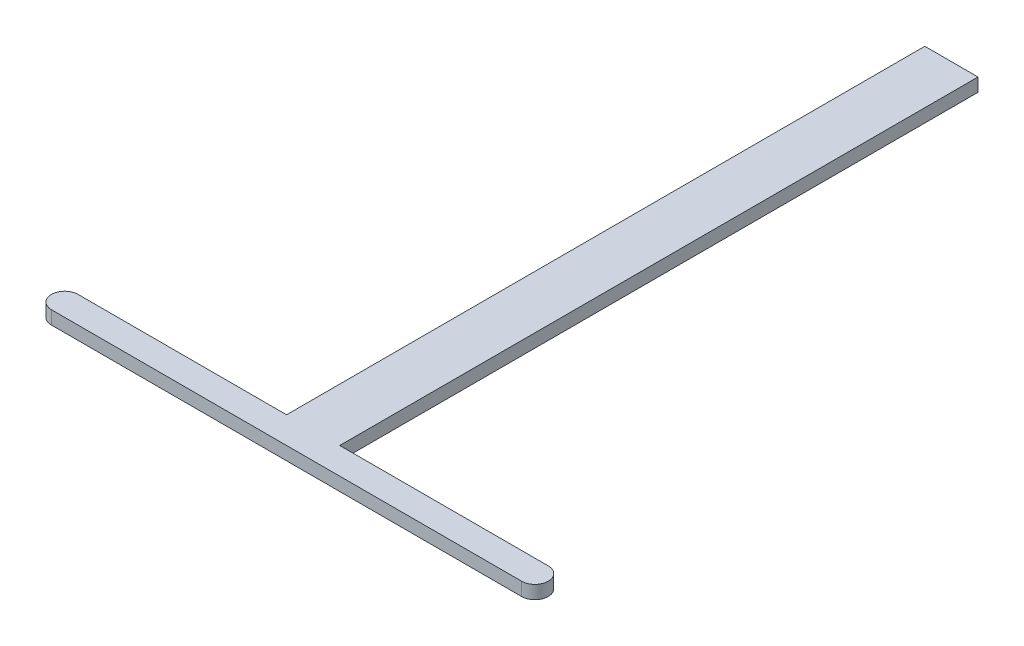
ISO-10303-21;
HEADER;
FILE_DESCRIPTION(('STEP AP214'),'2;1');
FILE_NAME('part.step','',(''),(''),'','','');
FILE_SCHEMA(('AUTOMOTIVE_DESIGN { 1 0 10303 214 1 1 1 1 }'));
ENDSEC;
DATA;
#1=APPLICATION_CONTEXT('core data for automotive mechanical design processes');
#2=APPLICATION_PROTOCOL_DEFINITION('international standard','automotive_design',2000,#1);
#3=PRODUCT_CONTEXT('',#1,'mechanical');
#4=PRODUCT('Part','Part','',(#3));
#5=PRODUCT_RELATED_PRODUCT_CATEGORY('part','',(#4));
#6=PRODUCT_DEFINITION_FORMATION('','',#4);
#7=PRODUCT_DEFINITION_CONTEXT('part definition',#1,'design');
#8=PRODUCT_DEFINITION('design','',#6,#7);
#9=PRODUCT_DEFINITION_SHAPE('','',#8);
#10=(LENGTH_UNIT() NAMED_UNIT(*) SI_UNIT(.MILLI.,.METRE.));
#11=(NAMED_UNIT(*) PLANE_ANGLE_UNIT() SI_UNIT($,.RADIAN.));
#12=(NAMED_UNIT(*) SI_UNIT($,.STERADIAN.) SOLID_ANGLE_UNIT());
#13=UNCERTAINTY_MEASURE_WITH_UNIT(LENGTH_MEASURE(1.E-05),#10,'distance_accuracy_value','');
#14=(GEOMETRIC_REPRESENTATION_CONTEXT(3) GLOBAL_UNCERTAINTY_ASSIGNED_CONTEXT((#13)) GLOBAL_UNIT_ASSIGNED_CONTEXT((#10,
#11,#12)) REPRESENTATION_CONTEXT('',''));
#15=CARTESIAN_POINT('',(0.,0.,0.));
#16=DIRECTION('',(0.,0.,1.));
#17=DIRECTION('',(1.,0.,0.));
#18=AXIS2_PLACEMENT_3D('',#15,#16,#17);
#19=CARTESIAN_POINT('',(-6.35000000000003,3.175,-152.4));
#20=DIRECTION('',(1.,0.,0.));
#21=DIRECTION('',(0.,0.,-1.));
#22=AXIS2_PLACEMENT_3D('',#19,#20,#21);
#23=PLANE('',#22);
#24=DIRECTION('',(0.,0.,1.));
#25=VECTOR('',#24,1.);
#26=CARTESIAN_POINT('',(-6.35000000000003,0.,-152.4));
#27=LINE('',#26,#25);
#28=CARTESIAN_POINT('',(-6.35000000000003,0.,-152.4));
#29=VERTEX_POINT('',#28);
#30=CARTESIAN_POINT('',(-6.34999999999999,0.,0.));
#31=VERTEX_POINT('',#30);
#32=EDGE_CURVE('E129',#29,#31,#27,.T.);
#33=ORIENTED_EDGE('',*,*,#32,.T.);
#34=DIRECTION('',(0.,-1.,0.));
#35=VECTOR('',#34,1.);
#36=CARTESIAN_POINT('',(-6.34999999999999,3.175,0.));
#37=LINE('',#36,#35);
#38=CARTESIAN_POINT('',(-6.34999999999999,3.175,0.));
#39=VERTEX_POINT('',#38);
#40=EDGE_CURVE('E11',#39,#31,#37,.T.);
#41=ORIENTED_EDGE('',*,*,#40,.F.);
#42=DIRECTION('',(0.,0.,1.));
#43=VECTOR('',#42,1.);
#44=CARTESIAN_POINT('',(-6.35000000000003,3.175,-152.4));
#45=LINE('',#44,#43);
#46=CARTESIAN_POINT('',(-6.35000000000003,3.175,-152.4));
#47=VERTEX_POINT('',#46);
#48=EDGE_CURVE('E143',#47,#39,#45,.T.);
#49=ORIENTED_EDGE('',*,*,#48,.F.);
#50=DIRECTION('',(0.,-1.,0.));
#51=VECTOR('',#50,1.);
#52=CARTESIAN_POINT('',(-6.35000000000003,3.175,-152.4));
#53=LINE('',#52,#51);
#54=EDGE_CURVE('E125',#47,#29,#53,.T.);
#55=ORIENTED_EDGE('',*,*,#54,.T.);
#56=EDGE_LOOP('',(#33,#41,#49,#55));
#57=FACE_BOUND('',#56,.T.);
#58=ADVANCED_FACE('F33',(#57),#23,.F.);
#59=CARTESIAN_POINT('',(-6.34999999999999,3.175,0.));
#60=DIRECTION('',(0.,0.,1.));
#61=DIRECTION('',(1.,0.,0.));
#62=AXIS2_PLACEMENT_3D('',#59,#60,#61);
#63=PLANE('',#62);
#64=DIRECTION('',(-1.,0.,0.));
#65=VECTOR('',#64,1.);
#66=CARTESIAN_POINT('',(-6.34999999999999,0.,0.));
#67=LINE('',#66,#65);
#68=CARTESIAN_POINT('',(-56.134,0.,0.));
#69=VERTEX_POINT('',#68);
#70=EDGE_CURVE('E132',#31,#69,#67,.T.);
#71=ORIENTED_EDGE('',*,*,#70,.T.);
#72=DIRECTION('',(0.,-1.,0.));
#73=VECTOR('',#72,1.);
#74=CARTESIAN_POINT('',(-56.134,3.175,0.));
#75=LINE('',#74,#73);
#76=CARTESIAN_POINT('',(-56.134,3.175,0.));
#77=VERTEX_POINT('',#76);
#78=EDGE_CURVE('E41',#77,#69,#75,.T.);
#79=ORIENTED_EDGE('',*,*,#78,.F.);
#80=DIRECTION('',(-1.,0.,0.));
#81=VECTOR('',#80,1.);
#82=CARTESIAN_POINT('',(-6.34999999999999,3.175,0.));
#83=LINE('',#82,#81);
#84=EDGE_CURVE('E92',#39,#77,#83,.T.);
#85=ORIENTED_EDGE('',*,*,#84,.F.);
#86=ORIENTED_EDGE('',*,*,#40,.T.);
#87=EDGE_LOOP('',(#71,#79,#85,#86));
#88=FACE_BOUND('',#87,.T.);
#89=ADVANCED_FACE('F178',(#88),#63,.F.);
#90=CARTESIAN_POINT('',(-56.134,3.175,3.17500000000001));
#91=DIRECTION('',(0.,-1.,0.));
#92=DIRECTION('',(0.,0.,-1.));
#93=AXIS2_PLACEMENT_3D('',#90,#91,#92);
#94=CYLINDRICAL_SURFACE('',#93,3.175);
#95=CARTESIAN_POINT('',(-56.134,0.,3.17500000000001));
#96=DIRECTION('',(0.,1.,0.));
#97=DIRECTION('',(0.,0.,1.));
#98=AXIS2_PLACEMENT_3D('',#95,#96,#97);
#99=CIRCLE('',#98,3.175);
#100=CARTESIAN_POINT('',(-56.134,0.,6.35000000000001));
#101=VERTEX_POINT('',#100);
#102=EDGE_CURVE('E134',#69,#101,#99,.T.);
#103=ORIENTED_EDGE('',*,*,#102,.T.);
#104=DIRECTION('',(0.,-1.,0.));
#105=VECTOR('',#104,1.);
#106=CARTESIAN_POINT('',(-56.134,3.175,6.35000000000001));
#107=LINE('',#106,#105);
#108=CARTESIAN_POINT('',(-56.134,3.175,6.35000000000001));
#109=VERTEX_POINT('',#108);
#110=EDGE_CURVE('E150',#109,#101,#107,.T.);
#111=ORIENTED_EDGE('',*,*,#110,.F.);
#112=CARTESIAN_POINT('',(-56.134,3.175,3.17500000000001));
#113=DIRECTION('',(0.,1.,0.));
#114=DIRECTION('',(0.,0.,1.));
#115=AXIS2_PLACEMENT_3D('',#112,#113,#114);
#116=CIRCLE('',#115,3.175);
#117=EDGE_CURVE('E158',#77,#109,#116,.T.);
#118=ORIENTED_EDGE('',*,*,#117,.F.);
#119=ORIENTED_EDGE('',*,*,#78,.T.);
#120=EDGE_LOOP('',(#103,#111,#118,#119));
#121=FACE_BOUND('',#120,.T.);
#122=ADVANCED_FACE('F156',(#121),#94,.T.);
#123=CARTESIAN_POINT('',(56.134,3.175,6.34999999999998));
#124=DIRECTION('',(0.,0.,-1.));
#125=DIRECTION('',(-1.,0.,0.));
#126=AXIS2_PLACEMENT_3D('',#123,#124,#125);
#127=PLANE('',#126);
#128=DIRECTION('',(1.,0.,0.));
#129=VECTOR('',#128,1.);
#130=CARTESIAN_POINT('',(56.134,0.,6.34999999999998));
#131=LINE('',#130,#129);
#132=CARTESIAN_POINT('',(56.134,0.,6.34999999999998));
#133=VERTEX_POINT('',#132);
#134=EDGE_CURVE('E136',#101,#133,#131,.T.);
#135=ORIENTED_EDGE('',*,*,#134,.T.);
#136=DIRECTION('',(0.,-1.,0.));
#137=VECTOR('',#136,1.);
#138=CARTESIAN_POINT('',(56.134,3.175,6.34999999999998));
#139=LINE('',#138,#137);
#140=CARTESIAN_POINT('',(56.134,3.175,6.34999999999998));
#141=VERTEX_POINT('',#140);
#142=EDGE_CURVE('E147',#141,#133,#139,.T.);
#143=ORIENTED_EDGE('',*,*,#142,.F.);
#144=DIRECTION('',(1.,0.,0.));
#145=VECTOR('',#144,1.);
#146=CARTESIAN_POINT('',(56.134,3.175,6.34999999999998));
#147=LINE('',#146,#145);
#148=EDGE_CURVE('E170',#109,#141,#147,.T.);
#149=ORIENTED_EDGE('',*,*,#148,.F.);
#150=ORIENTED_EDGE('',*,*,#110,.T.);
#151=EDGE_LOOP('',(#135,#143,#149,#150));
#152=FACE_BOUND('',#151,.T.);
#153=ADVANCED_FACE('F166',(#152),#127,.F.);
#154=CARTESIAN_POINT('',(56.134,3.175,3.17499999999998));
#155=DIRECTION('',(0.,-1.,0.));
#156=DIRECTION('',(0.,0.,-1.));
#157=AXIS2_PLACEMENT_3D('',#154,#155,#156);
#158=CYLINDRICAL_SURFACE('',#157,3.175);
#159=CARTESIAN_POINT('',(56.134,0.,3.17499999999998));
#160=DIRECTION('',(0.,1.,0.));
#161=DIRECTION('',(0.,0.,1.));
#162=AXIS2_PLACEMENT_3D('',#159,#160,#161);
#163=CIRCLE('',#162,3.175);
#164=CARTESIAN_POINT('',(56.134,0.,0.));
#165=VERTEX_POINT('',#164);
#166=EDGE_CURVE('E138',#133,#165,#163,.T.);
#167=ORIENTED_EDGE('',*,*,#166,.T.);
#168=DIRECTION('',(0.,-1.,0.));
#169=VECTOR('',#168,1.);
#170=CARTESIAN_POINT('',(56.134,3.175,0.));
#171=LINE('',#170,#169);
#172=CARTESIAN_POINT('',(56.134,3.175,0.));
#173=VERTEX_POINT('',#172);
#174=EDGE_CURVE('E120',#173,#165,#171,.T.);
#175=ORIENTED_EDGE('',*,*,#174,.F.);
#176=CARTESIAN_POINT('',(56.134,3.175,3.17499999999998));
#177=DIRECTION('',(0.,1.,0.));
#178=DIRECTION('',(0.,0.,1.));
#179=AXIS2_PLACEMENT_3D('',#176,#177,#178);
#180=CIRCLE('',#179,3.175);
#181=EDGE_CURVE('E111',#141,#173,#180,.T.);
#182=ORIENTED_EDGE('',*,*,#181,.F.);
#183=ORIENTED_EDGE('',*,*,#142,.T.);
#184=EDGE_LOOP('',(#167,#175,#182,#183));
#185=FACE_BOUND('',#184,.T.);
#186=ADVANCED_FACE('F169',(#185),#158,.T.);
#187=CARTESIAN_POINT('',(56.134,3.175,0.));
#188=DIRECTION('',(0.,0.,1.));
#189=DIRECTION('',(1.,0.,0.));
#190=AXIS2_PLACEMENT_3D('',#187,#188,#189);
#191=PLANE('',#190);
#192=DIRECTION('',(-1.,0.,0.));
#193=VECTOR('',#192,1.);
#194=CARTESIAN_POINT('',(56.134,0.,0.));
#195=LINE('',#194,#193);
#196=CARTESIAN_POINT('',(6.34999999999999,0.,0.));
#197=VERTEX_POINT('',#196);
#198=EDGE_CURVE('E119',#165,#197,#195,.T.);
#199=ORIENTED_EDGE('',*,*,#198,.T.);
#200=DIRECTION('',(0.,-1.,0.));
#201=VECTOR('',#200,1.);
#202=CARTESIAN_POINT('',(6.34999999999999,3.175,0.));
#203=LINE('',#202,#201);
#204=CARTESIAN_POINT('',(6.34999999999999,3.175,0.));
#205=VERTEX_POINT('',#204);
#206=EDGE_CURVE('E116',#205,#197,#203,.T.);
#207=ORIENTED_EDGE('',*,*,#206,.F.);
#208=DIRECTION('',(-1.,0.,0.));
#209=VECTOR('',#208,1.);
#210=CARTESIAN_POINT('',(56.134,3.175,0.));
#211=LINE('',#210,#209);
#212=EDGE_CURVE('E105',#173,#205,#211,.T.);
#213=ORIENTED_EDGE('',*,*,#212,.F.);
#214=ORIENTED_EDGE('',*,*,#174,.T.);
#215=EDGE_LOOP('',(#199,#207,#213,#214));
#216=FACE_BOUND('',#215,.T.);
#217=ADVANCED_FACE('F117',(#216),#191,.F.);
#218=CARTESIAN_POINT('',(6.34999999999998,3.175,-152.4));
#219=DIRECTION('',(-1.,0.,0.));
#220=DIRECTION('',(0.,0.,1.));
#221=AXIS2_PLACEMENT_3D('',#218,#219,#220);
#222=PLANE('',#221);
#223=DIRECTION('',(0.,0.,-1.));
#224=VECTOR('',#223,1.);
#225=CARTESIAN_POINT('',(6.34999999999998,0.,-152.4));
#226=LINE('',#225,#224);
#227=CARTESIAN_POINT('',(6.34999999999998,0.,-152.4));
#228=VERTEX_POINT('',#227);
#229=EDGE_CURVE('E78',#197,#228,#226,.T.);
#230=ORIENTED_EDGE('',*,*,#229,.T.);
#231=DIRECTION('',(0.,-1.,0.));
#232=VECTOR('',#231,1.);
#233=CARTESIAN_POINT('',(6.34999999999998,3.175,-152.4));
#234=LINE('',#233,#232);
#235=CARTESIAN_POINT('',(6.34999999999998,3.175,-152.4));
#236=VERTEX_POINT('',#235);
#237=EDGE_CURVE('E121',#236,#228,#234,.T.);
#238=ORIENTED_EDGE('',*,*,#237,.F.);
#239=DIRECTION('',(0.,0.,-1.));
#240=VECTOR('',#239,1.);
#241=CARTESIAN_POINT('',(6.34999999999998,3.175,-152.4));
#242=LINE('',#241,#240);
#243=EDGE_CURVE('E109',#205,#236,#242,.T.);
#244=ORIENTED_EDGE('',*,*,#243,.F.);
#245=ORIENTED_EDGE('',*,*,#206,.T.);
#246=EDGE_LOOP('',(#230,#238,#244,#245));
#247=FACE_BOUND('',#246,.T.);
#248=ADVANCED_FACE('F123',(#247),#222,.F.);
#249=CARTESIAN_POINT('',(-6.35000000000003,3.175,-152.4));
#250=DIRECTION('',(0.,0.,1.));
#251=DIRECTION('',(1.,0.,0.));
#252=AXIS2_PLACEMENT_3D('',#249,#250,#251);
#253=PLANE('',#252);
#254=DIRECTION('',(-1.,0.,0.));
#255=VECTOR('',#254,1.);
#256=CARTESIAN_POINT('',(-6.35000000000003,0.,-152.4));
#257=LINE('',#256,#255);
#258=EDGE_CURVE('E84',#228,#29,#257,.T.);
#259=ORIENTED_EDGE('',*,*,#258,.T.);
#260=ORIENTED_EDGE('',*,*,#54,.F.);
#261=DIRECTION('',(-1.,0.,0.));
#262=VECTOR('',#261,1.);
#263=CARTESIAN_POINT('',(-6.35000000000003,3.175,-152.4));
#264=LINE('',#263,#262);
#265=EDGE_CURVE('E49',#236,#47,#264,.T.);
#266=ORIENTED_EDGE('',*,*,#265,.F.);
#267=ORIENTED_EDGE('',*,*,#237,.T.);
#268=EDGE_LOOP('',(#259,#260,#266,#267));
#269=FACE_BOUND('',#268,.T.);
#270=ADVANCED_FACE('F194',(#269),#253,.F.);
#271=CARTESIAN_POINT('',(-56.134,3.175,3.17500000000001));
#272=DIRECTION('',(0.,1.,0.));
#273=DIRECTION('',(0.,0.,1.));
#274=AXIS2_PLACEMENT_3D('',#271,#272,#273);
#275=PLANE('',#274);
#276=ORIENTED_EDGE('',*,*,#48,.T.);
#277=ORIENTED_EDGE('',*,*,#84,.T.);
#278=ORIENTED_EDGE('',*,*,#117,.T.);
#279=ORIENTED_EDGE('',*,*,#148,.T.);
#280=ORIENTED_EDGE('',*,*,#181,.T.);
#281=ORIENTED_EDGE('',*,*,#212,.T.);
#282=ORIENTED_EDGE('',*,*,#243,.T.);
#283=ORIENTED_EDGE('',*,*,#265,.T.);
#284=EDGE_LOOP('',(#276,#277,#278,#279,#280,#281,#282,#283));
#285=FACE_BOUND('',#284,.T.);
#286=ADVANCED_FACE('F107',(#285),#275,.T.);
#287=CARTESIAN_POINT('',(-56.134,0.,3.17500000000001));
#288=DIRECTION('',(0.,1.,0.));
#289=DIRECTION('',(0.,0.,1.));
#290=AXIS2_PLACEMENT_3D('',#287,#288,#289);
#291=PLANE('',#290);
#292=ORIENTED_EDGE('',*,*,#32,.F.);
#293=ORIENTED_EDGE('',*,*,#258,.F.);
#294=ORIENTED_EDGE('',*,*,#229,.F.);
#295=ORIENTED_EDGE('',*,*,#198,.F.);
#296=ORIENTED_EDGE('',*,*,#166,.F.);
#297=ORIENTED_EDGE('',*,*,#134,.F.);
#298=ORIENTED_EDGE('',*,*,#102,.F.);
#299=ORIENTED_EDGE('',*,*,#70,.F.);
#300=EDGE_LOOP('',(#292,#293,#294,#295,#296,#297,#298,#299));
#301=FACE_BOUND('',#300,.T.);
#302=ADVANCED_FACE('F162',(#301),#291,.F.);
#303=CLOSED_SHELL('',(#58,#89,#122,#153,#186,#217,#248,#270,#286,#302));
#304=MANIFOLD_SOLID_BREP('B2',#303);
#305=ADVANCED_BREP_SHAPE_REPRESENTATION('',(#18,#304),#14);
#306=SHAPE_DEFINITION_REPRESENTATION(#9,#305);
ENDSEC;
END-ISO-10303-21;
